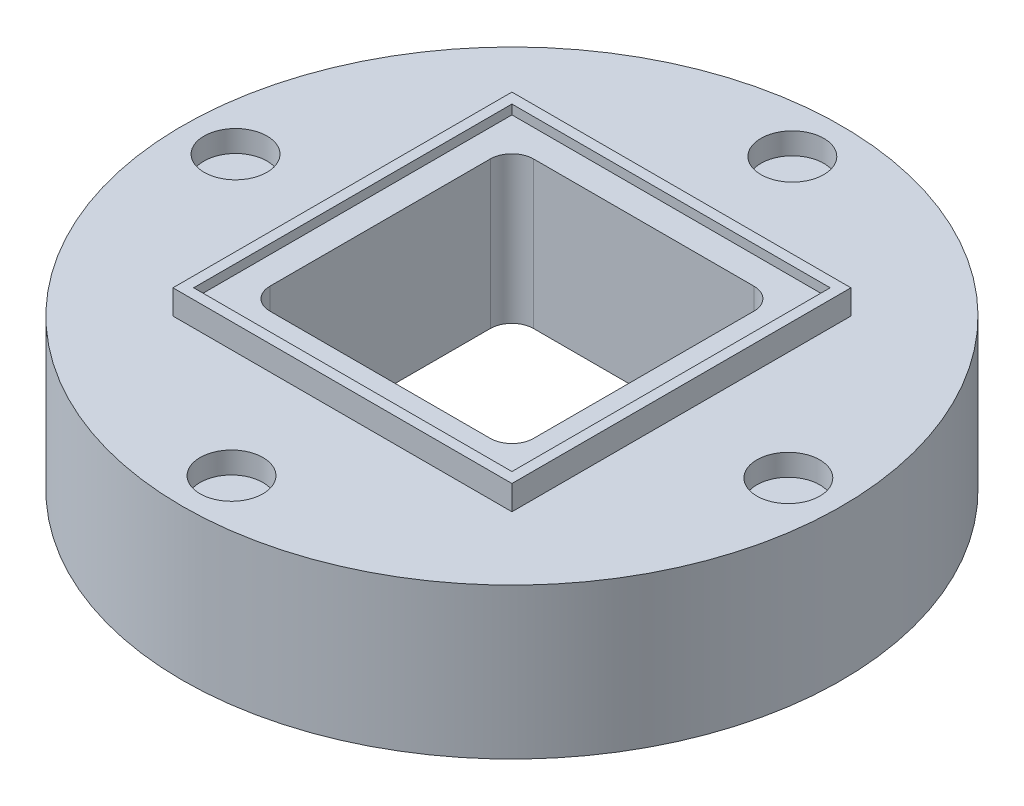
ISO-10303-21;
HEADER;
FILE_DESCRIPTION(('STEP AP214'),'2;1');
FILE_NAME('part.step','',(''),(''),'','','');
FILE_SCHEMA(('AUTOMOTIVE_DESIGN { 1 0 10303 214 1 1 1 1 }'));
ENDSEC;
DATA;
#1=APPLICATION_CONTEXT('core data for automotive mechanical design processes');
#2=APPLICATION_PROTOCOL_DEFINITION('international standard','automotive_design',2000,#1);
#3=PRODUCT_CONTEXT('',#1,'mechanical');
#4=PRODUCT('Part','Part','',(#3));
#5=PRODUCT_RELATED_PRODUCT_CATEGORY('part','',(#4));
#6=PRODUCT_DEFINITION_FORMATION('','',#4);
#7=PRODUCT_DEFINITION_CONTEXT('part definition',#1,'design');
#8=PRODUCT_DEFINITION('design','',#6,#7);
#9=PRODUCT_DEFINITION_SHAPE('','',#8);
#10=(LENGTH_UNIT() NAMED_UNIT(*) SI_UNIT(.MILLI.,.METRE.));
#11=(NAMED_UNIT(*) PLANE_ANGLE_UNIT() SI_UNIT($,.RADIAN.));
#12=(NAMED_UNIT(*) SI_UNIT($,.STERADIAN.) SOLID_ANGLE_UNIT());
#13=UNCERTAINTY_MEASURE_WITH_UNIT(LENGTH_MEASURE(1.E-05),#10,'distance_accuracy_value','');
#14=(GEOMETRIC_REPRESENTATION_CONTEXT(3) GLOBAL_UNCERTAINTY_ASSIGNED_CONTEXT((#13)) GLOBAL_UNIT_ASSIGNED_CONTEXT((#10,
#11,#12)) REPRESENTATION_CONTEXT('',''));
#15=CARTESIAN_POINT('',(0.,0.,0.));
#16=DIRECTION('',(0.,0.,1.));
#17=DIRECTION('',(1.,0.,0.));
#18=AXIS2_PLACEMENT_3D('',#15,#16,#17);
#19=CARTESIAN_POINT('',(0.,1.,0.));
#20=DIRECTION('',(0.,-1.,0.));
#21=DIRECTION('',(0.,0.,-1.));
#22=AXIS2_PLACEMENT_3D('',#19,#20,#21);
#23=PLANE('',#22);
#24=CARTESIAN_POINT('',(0.,1.,0.));
#25=DIRECTION('',(0.,-1.,0.));
#26=DIRECTION('',(0.,0.,-1.));
#27=AXIS2_PLACEMENT_3D('',#24,#25,#26);
#28=CIRCLE('',#27,16.5);
#29=CARTESIAN_POINT('',(0.,1.,-16.5));
#30=VERTEX_POINT('',#29);
#31=EDGE_CURVE('E301',#30,#30,#28,.T.);
#32=ORIENTED_EDGE('',*,*,#31,.T.);
#33=EDGE_LOOP('',(#32));
#34=FACE_BOUND('',#33,.T.);
#35=DIRECTION('',(-1.,0.,0.));
#36=VECTOR('',#35,1.);
#37=CARTESIAN_POINT('',(0.,1.,-7.));
#38=LINE('',#37,#36);
#39=CARTESIAN_POINT('',(5.85,1.,-7.));
#40=VERTEX_POINT('',#39);
#41=CARTESIAN_POINT('',(-5.85,1.,-7.));
#42=VERTEX_POINT('',#41);
#43=EDGE_CURVE('E211',#40,#42,#38,.T.);
#44=ORIENTED_EDGE('',*,*,#43,.T.);
#45=CARTESIAN_POINT('',(-5.85,1.,-5.84999999999964));
#46=DIRECTION('',(0.,-1.,0.));
#47=DIRECTION('',(0.,0.,-1.));
#48=AXIS2_PLACEMENT_3D('',#45,#46,#47);
#49=CIRCLE('',#48,1.15);
#50=CARTESIAN_POINT('',(-7.,1.,-5.84999999999964));
#51=VERTEX_POINT('',#50);
#52=EDGE_CURVE('E214',#42,#51,#49,.F.);
#53=ORIENTED_EDGE('',*,*,#52,.T.);
#54=DIRECTION('',(0.,0.,1.));
#55=VECTOR('',#54,1.);
#56=CARTESIAN_POINT('',(-7.,1.,0.));
#57=LINE('',#56,#55);
#58=CARTESIAN_POINT('',(-7.,1.,5.85000000000035));
#59=VERTEX_POINT('',#58);
#60=EDGE_CURVE('E188',#51,#59,#57,.T.);
#61=ORIENTED_EDGE('',*,*,#60,.T.);
#62=CARTESIAN_POINT('',(-5.84999999999964,1.,5.85000000000035));
#63=DIRECTION('',(0.,-1.,0.));
#64=DIRECTION('',(0.,0.,-1.));
#65=AXIS2_PLACEMENT_3D('',#62,#63,#64);
#66=CIRCLE('',#65,1.15);
#67=CARTESIAN_POINT('',(-5.84999999999964,1.,7.));
#68=VERTEX_POINT('',#67);
#69=EDGE_CURVE('E157',#59,#68,#66,.F.);
#70=ORIENTED_EDGE('',*,*,#69,.T.);
#71=DIRECTION('',(-1.,0.,0.));
#72=VECTOR('',#71,1.);
#73=CARTESIAN_POINT('',(0.,1.,7.));
#74=LINE('',#73,#72);
#75=CARTESIAN_POINT('',(5.85000000000035,1.,7.));
#76=VERTEX_POINT('',#75);
#77=EDGE_CURVE('E201',#76,#68,#74,.T.);
#78=ORIENTED_EDGE('',*,*,#77,.F.);
#79=CARTESIAN_POINT('',(5.85000000000035,1.,5.85));
#80=DIRECTION('',(0.,-1.,0.));
#81=DIRECTION('',(0.,0.,-1.));
#82=AXIS2_PLACEMENT_3D('',#79,#80,#81);
#83=CIRCLE('',#82,1.15);
#84=CARTESIAN_POINT('',(7.,1.,5.85));
#85=VERTEX_POINT('',#84);
#86=EDGE_CURVE('E203',#76,#85,#83,.F.);
#87=ORIENTED_EDGE('',*,*,#86,.T.);
#88=DIRECTION('',(0.,0.,1.));
#89=VECTOR('',#88,1.);
#90=CARTESIAN_POINT('',(7.,1.,0.));
#91=LINE('',#90,#89);
#92=CARTESIAN_POINT('',(7.,1.,-5.85));
#93=VERTEX_POINT('',#92);
#94=EDGE_CURVE('E206',#93,#85,#91,.T.);
#95=ORIENTED_EDGE('',*,*,#94,.F.);
#96=CARTESIAN_POINT('',(5.85,1.,-5.85));
#97=DIRECTION('',(0.,-1.,0.));
#98=DIRECTION('',(0.,0.,-1.));
#99=AXIS2_PLACEMENT_3D('',#96,#97,#98);
#100=CIRCLE('',#99,1.15);
#101=EDGE_CURVE('E208',#93,#40,#100,.F.);
#102=ORIENTED_EDGE('',*,*,#101,.T.);
#103=EDGE_LOOP('',(#44,#53,#61,#70,#78,#87,#95,#102));
#104=FACE_BOUND('',#103,.T.);
#105=ADVANCED_FACE('F38',(#34,#104),#23,.T.);
#106=CARTESIAN_POINT('',(0.,8.8,0.));
#107=DIRECTION('',(0.,1.,0.));
#108=DIRECTION('',(0.,0.,1.));
#109=AXIS2_PLACEMENT_3D('',#106,#107,#108);
#110=PLANE('',#109);
#111=DIRECTION('',(-1.,0.,0.));
#112=VECTOR('',#111,1.);
#113=CARTESIAN_POINT('',(0.,8.8,8.45));
#114=LINE('',#113,#112);
#115=CARTESIAN_POINT('',(8.45,8.8,8.45));
#116=VERTEX_POINT('',#115);
#117=CARTESIAN_POINT('',(-8.45,8.8,8.45));
#118=VERTEX_POINT('',#117);
#119=EDGE_CURVE('E222',#116,#118,#114,.T.);
#120=ORIENTED_EDGE('',*,*,#119,.F.);
#121=DIRECTION('',(0.,0.,-1.));
#122=VECTOR('',#121,1.);
#123=CARTESIAN_POINT('',(8.45,8.8,0.));
#124=LINE('',#123,#122);
#125=CARTESIAN_POINT('',(8.45,8.8,-8.45));
#126=VERTEX_POINT('',#125);
#127=EDGE_CURVE('E11',#116,#126,#124,.T.);
#128=ORIENTED_EDGE('',*,*,#127,.T.);
#129=DIRECTION('',(-1.,0.,0.));
#130=VECTOR('',#129,1.);
#131=CARTESIAN_POINT('',(0.,8.8,-8.45));
#132=LINE('',#131,#130);
#133=CARTESIAN_POINT('',(-8.45,8.8,-8.45));
#134=VERTEX_POINT('',#133);
#135=EDGE_CURVE('E217',#126,#134,#132,.T.);
#136=ORIENTED_EDGE('',*,*,#135,.T.);
#137=DIRECTION('',(0.,0.,-1.));
#138=VECTOR('',#137,1.);
#139=CARTESIAN_POINT('',(-8.45,8.8,0.));
#140=LINE('',#139,#138);
#141=EDGE_CURVE('E220',#118,#134,#140,.T.);
#142=ORIENTED_EDGE('',*,*,#141,.F.);
#143=EDGE_LOOP('',(#120,#128,#136,#142));
#144=FACE_BOUND('',#143,.T.);
#145=DIRECTION('',(0.,0.,-1.));
#146=VECTOR('',#145,1.);
#147=CARTESIAN_POINT('',(-7.,8.8,0.));
#148=LINE('',#147,#146);
#149=CARTESIAN_POINT('',(-7.,8.8,5.85000000000035));
#150=VERTEX_POINT('',#149);
#151=CARTESIAN_POINT('',(-7.,8.8,-5.84999999999964));
#152=VERTEX_POINT('',#151);
#153=EDGE_CURVE('E163',#150,#152,#148,.T.);
#154=ORIENTED_EDGE('',*,*,#153,.T.);
#155=CARTESIAN_POINT('',(-5.85,8.8,-5.84999999999964));
#156=DIRECTION('',(0.,1.,0.));
#157=DIRECTION('',(0.,0.,1.));
#158=AXIS2_PLACEMENT_3D('',#155,#156,#157);
#159=CIRCLE('',#158,1.15);
#160=CARTESIAN_POINT('',(-5.85,8.8,-7.));
#161=VERTEX_POINT('',#160);
#162=EDGE_CURVE('E61',#152,#161,#159,.F.);
#163=ORIENTED_EDGE('',*,*,#162,.T.);
#164=DIRECTION('',(1.,0.,0.));
#165=VECTOR('',#164,1.);
#166=CARTESIAN_POINT('',(0.,8.8,-7.));
#167=LINE('',#166,#165);
#168=CARTESIAN_POINT('',(5.85,8.8,-7.));
#169=VERTEX_POINT('',#168);
#170=EDGE_CURVE('E183',#161,#169,#167,.T.);
#171=ORIENTED_EDGE('',*,*,#170,.T.);
#172=CARTESIAN_POINT('',(5.85,8.8,-5.85));
#173=DIRECTION('',(0.,1.,0.));
#174=DIRECTION('',(0.,0.,1.));
#175=AXIS2_PLACEMENT_3D('',#172,#173,#174);
#176=CIRCLE('',#175,1.15);
#177=CARTESIAN_POINT('',(7.,8.8,-5.85));
#178=VERTEX_POINT('',#177);
#179=EDGE_CURVE('E180',#169,#178,#176,.F.);
#180=ORIENTED_EDGE('',*,*,#179,.T.);
#181=DIRECTION('',(0.,0.,-1.));
#182=VECTOR('',#181,1.);
#183=CARTESIAN_POINT('',(7.,8.8,0.));
#184=LINE('',#183,#182);
#185=CARTESIAN_POINT('',(7.,8.8,5.85));
#186=VERTEX_POINT('',#185);
#187=EDGE_CURVE('E177',#186,#178,#184,.T.);
#188=ORIENTED_EDGE('',*,*,#187,.F.);
#189=CARTESIAN_POINT('',(5.85000000000035,8.8,5.85));
#190=DIRECTION('',(0.,1.,0.));
#191=DIRECTION('',(0.,0.,1.));
#192=AXIS2_PLACEMENT_3D('',#189,#190,#191);
#193=CIRCLE('',#192,1.15);
#194=CARTESIAN_POINT('',(5.85000000000035,8.8,7.));
#195=VERTEX_POINT('',#194);
#196=EDGE_CURVE('E172',#186,#195,#193,.F.);
#197=ORIENTED_EDGE('',*,*,#196,.T.);
#198=DIRECTION('',(1.,0.,0.));
#199=VECTOR('',#198,1.);
#200=CARTESIAN_POINT('',(0.,8.8,7.));
#201=LINE('',#200,#199);
#202=CARTESIAN_POINT('',(-5.84999999999964,8.8,7.));
#203=VERTEX_POINT('',#202);
#204=EDGE_CURVE('E170',#203,#195,#201,.T.);
#205=ORIENTED_EDGE('',*,*,#204,.F.);
#206=CARTESIAN_POINT('',(-5.84999999999964,8.8,5.85000000000035));
#207=DIRECTION('',(0.,1.,0.));
#208=DIRECTION('',(0.,0.,1.));
#209=AXIS2_PLACEMENT_3D('',#206,#207,#208);
#210=CIRCLE('',#209,1.15);
#211=EDGE_CURVE('E154',#203,#150,#210,.F.);
#212=ORIENTED_EDGE('',*,*,#211,.T.);
#213=EDGE_LOOP('',(#154,#163,#171,#180,#188,#197,#205,#212));
#214=FACE_BOUND('',#213,.T.);
#215=ADVANCED_FACE('F167',(#144,#214),#110,.T.);
#216=CARTESIAN_POINT('',(0.,8.,0.));
#217=DIRECTION('',(0.,-1.,0.));
#218=DIRECTION('',(0.,0.,-1.));
#219=AXIS2_PLACEMENT_3D('',#216,#217,#218);
#220=CYLINDRICAL_SURFACE('',#219,17.5);
#221=CARTESIAN_POINT('',(0.,8.,0.));
#222=DIRECTION('',(0.,1.,0.));
#223=DIRECTION('',(0.,0.,1.));
#224=AXIS2_PLACEMENT_3D('',#221,#222,#223);
#225=CIRCLE('',#224,17.5);
#226=CARTESIAN_POINT('',(0.,8.,17.5));
#227=VERTEX_POINT('',#226);
#228=EDGE_CURVE('E46',#227,#227,#225,.T.);
#229=ORIENTED_EDGE('',*,*,#228,.F.);
#230=EDGE_LOOP('',(#229));
#231=FACE_BOUND('',#230,.T.);
#232=CARTESIAN_POINT('',(0.,0.,0.));
#233=DIRECTION('',(0.,1.,0.));
#234=DIRECTION('',(0.,0.,1.));
#235=AXIS2_PLACEMENT_3D('',#232,#233,#234);
#236=CIRCLE('',#235,17.5);
#237=CARTESIAN_POINT('',(0.,0.,17.5));
#238=VERTEX_POINT('',#237);
#239=EDGE_CURVE('E304',#238,#238,#236,.T.);
#240=ORIENTED_EDGE('',*,*,#239,.T.);
#241=EDGE_LOOP('',(#240));
#242=FACE_BOUND('',#241,.T.);
#243=ADVANCED_FACE('F40',(#231,#242),#220,.T.);
#244=CARTESIAN_POINT('',(0.,8.,0.));
#245=DIRECTION('',(0.,1.,0.));
#246=DIRECTION('',(0.,0.,1.));
#247=AXIS2_PLACEMENT_3D('',#244,#245,#246);
#248=PLANE('',#247);
#249=DIRECTION('',(0.,0.,-1.));
#250=VECTOR('',#249,1.);
#251=CARTESIAN_POINT('',(-9.,8.,0.));
#252=LINE('',#251,#250);
#253=CARTESIAN_POINT('',(-9.,8.,9.));
#254=VERTEX_POINT('',#253);
#255=CARTESIAN_POINT('',(-9.,8.,-9.));
#256=VERTEX_POINT('',#255);
#257=EDGE_CURVE('E224',#254,#256,#252,.T.);
#258=ORIENTED_EDGE('',*,*,#257,.T.);
#259=DIRECTION('',(-1.,0.,0.));
#260=VECTOR('',#259,1.);
#261=CARTESIAN_POINT('',(0.,8.,-9.));
#262=LINE('',#261,#260);
#263=CARTESIAN_POINT('',(9.,8.,-9.));
#264=VERTEX_POINT('',#263);
#265=EDGE_CURVE('E229',#264,#256,#262,.T.);
#266=ORIENTED_EDGE('',*,*,#265,.F.);
#267=DIRECTION('',(0.,0.,-1.));
#268=VECTOR('',#267,1.);
#269=CARTESIAN_POINT('',(9.,8.,0.));
#270=LINE('',#269,#268);
#271=CARTESIAN_POINT('',(9.,8.,9.));
#272=VERTEX_POINT('',#271);
#273=EDGE_CURVE('E253',#272,#264,#270,.T.);
#274=ORIENTED_EDGE('',*,*,#273,.F.);
#275=DIRECTION('',(-1.,0.,0.));
#276=VECTOR('',#275,1.);
#277=CARTESIAN_POINT('',(0.,8.,9.));
#278=LINE('',#277,#276);
#279=EDGE_CURVE('E250',#272,#254,#278,.T.);
#280=ORIENTED_EDGE('',*,*,#279,.T.);
#281=EDGE_LOOP('',(#258,#266,#274,#280));
#282=FACE_BOUND('',#281,.T.);
#283=CARTESIAN_POINT('',(14.7834126807695,8.,0.106708515967393));
#284=DIRECTION('',(0.,1.,0.));
#285=DIRECTION('',(-1.,0.,0.));
#286=AXIS2_PLACEMENT_3D('',#283,#284,#285);
#287=CIRCLE('',#286,1.67);
#288=CARTESIAN_POINT('',(13.1134126807695,8.,0.106708515967411));
#289=VERTEX_POINT('',#288);
#290=EDGE_CURVE('E270',#289,#289,#287,.T.);
#291=ORIENTED_EDGE('',*,*,#290,.F.);
#292=EDGE_LOOP('',(#291));
#293=FACE_BOUND('',#292,.T.);
#294=CARTESIAN_POINT('',(-0.106708515967548,8.,14.7834126807695));
#295=DIRECTION('',(0.,1.,0.));
#296=DIRECTION('',(0.,0.,-1.));
#297=AXIS2_PLACEMENT_3D('',#294,#295,#296);
#298=CIRCLE('',#297,1.67);
#299=CARTESIAN_POINT('',(-0.106708515967548,8.,13.1134126807695));
#300=VERTEX_POINT('',#299);
#301=EDGE_CURVE('E280',#300,#300,#298,.T.);
#302=ORIENTED_EDGE('',*,*,#301,.F.);
#303=EDGE_LOOP('',(#302));
#304=FACE_BOUND('',#303,.T.);
#305=CARTESIAN_POINT('',(-14.7834126807695,8.,-0.106708515967496));
#306=DIRECTION('',(0.,1.,0.));
#307=DIRECTION('',(1.,0.,0.));
#308=AXIS2_PLACEMENT_3D('',#305,#306,#307);
#309=CIRCLE('',#308,1.67);
#310=CARTESIAN_POINT('',(-13.1134126807695,8.,-0.106708515967502));
#311=VERTEX_POINT('',#310);
#312=EDGE_CURVE('E286',#311,#311,#309,.T.);
#313=ORIENTED_EDGE('',*,*,#312,.F.);
#314=EDGE_LOOP('',(#313));
#315=FACE_BOUND('',#314,.T.);
#316=CARTESIAN_POINT('',(0.106708515967548,8.,-14.7834126807695));
#317=DIRECTION('',(0.,1.,0.));
#318=DIRECTION('',(0.,0.,1.));
#319=AXIS2_PLACEMENT_3D('',#316,#317,#318);
#320=CIRCLE('',#319,1.67);
#321=CARTESIAN_POINT('',(0.106708515967548,8.,-13.1134126807695));
#322=VERTEX_POINT('',#321);
#323=EDGE_CURVE('E292',#322,#322,#320,.T.);
#324=ORIENTED_EDGE('',*,*,#323,.F.);
#325=EDGE_LOOP('',(#324));
#326=FACE_BOUND('',#325,.T.);
#327=ORIENTED_EDGE('',*,*,#228,.T.);
#328=EDGE_LOOP('',(#327));
#329=FACE_BOUND('',#328,.T.);
#330=ADVANCED_FACE('F315',(#282,#293,#304,#315,#326,#329),#248,.T.);
#331=CARTESIAN_POINT('',(0.,0.,0.));
#332=DIRECTION('',(0.,1.,0.));
#333=DIRECTION('',(0.,0.,1.));
#334=AXIS2_PLACEMENT_3D('',#331,#332,#333);
#335=PLANE('',#334);
#336=CARTESIAN_POINT('',(0.,0.,0.));
#337=DIRECTION('',(0.,-1.,0.));
#338=DIRECTION('',(0.,0.,-1.));
#339=AXIS2_PLACEMENT_3D('',#336,#337,#338);
#340=CIRCLE('',#339,16.5);
#341=CARTESIAN_POINT('',(0.,0.,-16.5));
#342=VERTEX_POINT('',#341);
#343=EDGE_CURVE('E298',#342,#342,#340,.T.);
#344=ORIENTED_EDGE('',*,*,#343,.F.);
#345=EDGE_LOOP('',(#344));
#346=FACE_BOUND('',#345,.T.);
#347=ORIENTED_EDGE('',*,*,#239,.F.);
#348=EDGE_LOOP('',(#347));
#349=FACE_BOUND('',#348,.T.);
#350=ADVANCED_FACE('F312',(#346,#349),#335,.F.);
#351=CARTESIAN_POINT('',(0.,1.,0.));
#352=DIRECTION('',(0.,-1.,0.));
#353=DIRECTION('',(0.,0.,-1.));
#354=AXIS2_PLACEMENT_3D('',#351,#352,#353);
#355=CYLINDRICAL_SURFACE('',#354,16.5);
#356=ORIENTED_EDGE('',*,*,#31,.F.);
#357=EDGE_LOOP('',(#356));
#358=FACE_BOUND('',#357,.T.);
#359=ORIENTED_EDGE('',*,*,#343,.T.);
#360=EDGE_LOOP('',(#359));
#361=FACE_BOUND('',#360,.T.);
#362=ADVANCED_FACE('F314',(#358,#361),#355,.F.);
#363=CARTESIAN_POINT('',(0.106708515967548,6.85,-14.7834126807695));
#364=DIRECTION('',(0.,1.,0.));
#365=DIRECTION('',(0.,0.,1.));
#366=AXIS2_PLACEMENT_3D('',#363,#364,#365);
#367=CYLINDRICAL_SURFACE('',#366,1.67);
#368=CARTESIAN_POINT('',(0.106708515967548,6.85,-14.7834126807695));
#369=DIRECTION('',(0.,1.,0.));
#370=DIRECTION('',(0.,0.,1.));
#371=AXIS2_PLACEMENT_3D('',#368,#369,#370);
#372=CIRCLE('',#371,1.67);
#373=CARTESIAN_POINT('',(0.106708515967548,6.85,-13.1134126807695));
#374=VERTEX_POINT('',#373);
#375=EDGE_CURVE('E295',#374,#374,#372,.T.);
#376=ORIENTED_EDGE('',*,*,#375,.F.);
#377=EDGE_LOOP('',(#376));
#378=FACE_BOUND('',#377,.T.);
#379=ORIENTED_EDGE('',*,*,#323,.T.);
#380=EDGE_LOOP('',(#379));
#381=FACE_BOUND('',#380,.T.);
#382=ADVANCED_FACE('F321',(#378,#381),#367,.F.);
#383=CARTESIAN_POINT('',(0.106708515967548,6.85,-14.7834126807695));
#384=DIRECTION('',(0.,1.,0.));
#385=DIRECTION('',(0.,0.,1.));
#386=AXIS2_PLACEMENT_3D('',#383,#384,#385);
#387=PLANE('',#386);
#388=ORIENTED_EDGE('',*,*,#375,.T.);
#389=EDGE_LOOP('',(#388));
#390=FACE_BOUND('',#389,.T.);
#391=ADVANCED_FACE('F339',(#390),#387,.T.);
#392=CARTESIAN_POINT('',(-14.7834126807695,6.85,-0.106708515967496));
#393=DIRECTION('',(0.,1.,0.));
#394=DIRECTION('',(0.,0.,1.));
#395=AXIS2_PLACEMENT_3D('',#392,#393,#394);
#396=CYLINDRICAL_SURFACE('',#395,1.67);
#397=CARTESIAN_POINT('',(-14.7834126807695,6.85,-0.106708515967496));
#398=DIRECTION('',(0.,1.,0.));
#399=DIRECTION('',(1.,0.,0.));
#400=AXIS2_PLACEMENT_3D('',#397,#398,#399);
#401=CIRCLE('',#400,1.67);
#402=CARTESIAN_POINT('',(-13.1134126807695,6.85,-0.106708515967502));
#403=VERTEX_POINT('',#402);
#404=EDGE_CURVE('E289',#403,#403,#401,.T.);
#405=ORIENTED_EDGE('',*,*,#404,.F.);
#406=EDGE_LOOP('',(#405));
#407=FACE_BOUND('',#406,.T.);
#408=ORIENTED_EDGE('',*,*,#312,.T.);
#409=EDGE_LOOP('',(#408));
#410=FACE_BOUND('',#409,.T.);
#411=ADVANCED_FACE('F343',(#407,#410),#396,.F.);
#412=CARTESIAN_POINT('',(-14.7834126807695,6.85,-0.106708515967496));
#413=DIRECTION('',(0.,1.,0.));
#414=DIRECTION('',(1.,0.,0.));
#415=AXIS2_PLACEMENT_3D('',#412,#413,#414);
#416=PLANE('',#415);
#417=ORIENTED_EDGE('',*,*,#404,.T.);
#418=EDGE_LOOP('',(#417));
#419=FACE_BOUND('',#418,.T.);
#420=ADVANCED_FACE('F347',(#419),#416,.T.);
#421=CARTESIAN_POINT('',(-0.106708515967548,6.85,14.7834126807695));
#422=DIRECTION('',(0.,1.,0.));
#423=DIRECTION('',(0.,0.,1.));
#424=AXIS2_PLACEMENT_3D('',#421,#422,#423);
#425=CYLINDRICAL_SURFACE('',#424,1.67);
#426=CARTESIAN_POINT('',(-0.106708515967548,6.85,14.7834126807695));
#427=DIRECTION('',(0.,1.,0.));
#428=DIRECTION('',(0.,0.,-1.));
#429=AXIS2_PLACEMENT_3D('',#426,#427,#428);
#430=CIRCLE('',#429,1.67);
#431=CARTESIAN_POINT('',(-0.106708515967548,6.85,13.1134126807695));
#432=VERTEX_POINT('',#431);
#433=EDGE_CURVE('E283',#432,#432,#430,.T.);
#434=ORIENTED_EDGE('',*,*,#433,.F.);
#435=EDGE_LOOP('',(#434));
#436=FACE_BOUND('',#435,.T.);
#437=ORIENTED_EDGE('',*,*,#301,.T.);
#438=EDGE_LOOP('',(#437));
#439=FACE_BOUND('',#438,.T.);
#440=ADVANCED_FACE('F351',(#436,#439),#425,.F.);
#441=CARTESIAN_POINT('',(-0.106708515967548,6.85,14.7834126807695));
#442=DIRECTION('',(0.,1.,0.));
#443=DIRECTION('',(0.,0.,-1.));
#444=AXIS2_PLACEMENT_3D('',#441,#442,#443);
#445=PLANE('',#444);
#446=ORIENTED_EDGE('',*,*,#433,.T.);
#447=EDGE_LOOP('',(#446));
#448=FACE_BOUND('',#447,.T.);
#449=ADVANCED_FACE('F355',(#448),#445,.T.);
#450=CARTESIAN_POINT('',(14.7834126807695,6.85,0.106708515967393));
#451=DIRECTION('',(0.,1.,0.));
#452=DIRECTION('',(0.,0.,1.));
#453=AXIS2_PLACEMENT_3D('',#450,#451,#452);
#454=CYLINDRICAL_SURFACE('',#453,1.67);
#455=CARTESIAN_POINT('',(14.7834126807695,6.85,0.106708515967393));
#456=DIRECTION('',(0.,1.,0.));
#457=DIRECTION('',(-1.,0.,0.));
#458=AXIS2_PLACEMENT_3D('',#455,#456,#457);
#459=CIRCLE('',#458,1.67);
#460=CARTESIAN_POINT('',(13.1134126807695,6.85,0.106708515967411));
#461=VERTEX_POINT('',#460);
#462=EDGE_CURVE('E277',#461,#461,#459,.T.);
#463=ORIENTED_EDGE('',*,*,#462,.F.);
#464=EDGE_LOOP('',(#463));
#465=FACE_BOUND('',#464,.T.);
#466=ORIENTED_EDGE('',*,*,#290,.T.);
#467=EDGE_LOOP('',(#466));
#468=FACE_BOUND('',#467,.T.);
#469=ADVANCED_FACE('F359',(#465,#468),#454,.F.);
#470=CARTESIAN_POINT('',(14.7834126807695,6.85,0.106708515967393));
#471=DIRECTION('',(0.,1.,0.));
#472=DIRECTION('',(-1.,0.,0.));
#473=AXIS2_PLACEMENT_3D('',#470,#471,#472);
#474=PLANE('',#473);
#475=ORIENTED_EDGE('',*,*,#462,.T.);
#476=EDGE_LOOP('',(#475));
#477=FACE_BOUND('',#476,.T.);
#478=ADVANCED_FACE('F363',(#477),#474,.T.);
#479=CARTESIAN_POINT('',(0.,9.3,8.45));
#480=DIRECTION('',(0.,0.,1.));
#481=DIRECTION('',(1.,0.,0.));
#482=AXIS2_PLACEMENT_3D('',#479,#480,#481);
#483=PLANE('',#482);
#484=DIRECTION('',(0.,-1.,0.));
#485=VECTOR('',#484,1.);
#486=CARTESIAN_POINT('',(8.45,9.3,8.45));
#487=LINE('',#486,#485);
#488=CARTESIAN_POINT('',(8.45,9.3,8.45));
#489=VERTEX_POINT('',#488);
#490=EDGE_CURVE('E258',#489,#116,#487,.T.);
#491=ORIENTED_EDGE('',*,*,#490,.T.);
#492=ORIENTED_EDGE('',*,*,#119,.T.);
#493=DIRECTION('',(0.,-1.,0.));
#494=VECTOR('',#493,1.);
#495=CARTESIAN_POINT('',(-8.45,9.3,8.45));
#496=LINE('',#495,#494);
#497=CARTESIAN_POINT('',(-8.45,9.3,8.45));
#498=VERTEX_POINT('',#497);
#499=EDGE_CURVE('E267',#498,#118,#496,.T.);
#500=ORIENTED_EDGE('',*,*,#499,.F.);
#501=DIRECTION('',(-1.,0.,0.));
#502=VECTOR('',#501,1.);
#503=CARTESIAN_POINT('',(0.,9.3,8.45));
#504=LINE('',#503,#502);
#505=EDGE_CURVE('E236',#489,#498,#504,.T.);
#506=ORIENTED_EDGE('',*,*,#505,.F.);
#507=EDGE_LOOP('',(#491,#492,#500,#506));
#508=FACE_BOUND('',#507,.T.);
#509=ADVANCED_FACE('F367',(#508),#483,.F.);
#510=CARTESIAN_POINT('',(-8.45,9.3,0.));
#511=DIRECTION('',(-1.,0.,0.));
#512=DIRECTION('',(0.,0.,1.));
#513=AXIS2_PLACEMENT_3D('',#510,#511,#512);
#514=PLANE('',#513);
#515=ORIENTED_EDGE('',*,*,#499,.T.);
#516=ORIENTED_EDGE('',*,*,#141,.T.);
#517=DIRECTION('',(0.,-1.,0.));
#518=VECTOR('',#517,1.);
#519=CARTESIAN_POINT('',(-8.45,9.3,-8.45));
#520=LINE('',#519,#518);
#521=CARTESIAN_POINT('',(-8.45,9.3,-8.45));
#522=VERTEX_POINT('',#521);
#523=EDGE_CURVE('E264',#522,#134,#520,.T.);
#524=ORIENTED_EDGE('',*,*,#523,.F.);
#525=DIRECTION('',(0.,0.,-1.));
#526=VECTOR('',#525,1.);
#527=CARTESIAN_POINT('',(-8.45,9.3,0.));
#528=LINE('',#527,#526);
#529=EDGE_CURVE('E239',#498,#522,#528,.T.);
#530=ORIENTED_EDGE('',*,*,#529,.F.);
#531=EDGE_LOOP('',(#515,#516,#524,#530));
#532=FACE_BOUND('',#531,.T.);
#533=ADVANCED_FACE('F389',(#532),#514,.F.);
#534=CARTESIAN_POINT('',(0.,9.3,-8.45));
#535=DIRECTION('',(0.,0.,1.));
#536=DIRECTION('',(1.,0.,0.));
#537=AXIS2_PLACEMENT_3D('',#534,#535,#536);
#538=PLANE('',#537);
#539=ORIENTED_EDGE('',*,*,#135,.F.);
#540=DIRECTION('',(0.,-1.,0.));
#541=VECTOR('',#540,1.);
#542=CARTESIAN_POINT('',(8.45,9.3,-8.45));
#543=LINE('',#542,#541);
#544=CARTESIAN_POINT('',(8.45,9.3,-8.45));
#545=VERTEX_POINT('',#544);
#546=EDGE_CURVE('E261',#545,#126,#543,.T.);
#547=ORIENTED_EDGE('',*,*,#546,.F.);
#548=DIRECTION('',(-1.,0.,0.));
#549=VECTOR('',#548,1.);
#550=CARTESIAN_POINT('',(0.,9.3,-8.45));
#551=LINE('',#550,#549);
#552=EDGE_CURVE('E241',#545,#522,#551,.T.);
#553=ORIENTED_EDGE('',*,*,#552,.T.);
#554=ORIENTED_EDGE('',*,*,#523,.T.);
#555=EDGE_LOOP('',(#539,#547,#553,#554));
#556=FACE_BOUND('',#555,.T.);
#557=ADVANCED_FACE('F373',(#556),#538,.T.);
#558=CARTESIAN_POINT('',(-9.,9.3,0.));
#559=DIRECTION('',(-1.,0.,0.));
#560=DIRECTION('',(0.,0.,1.));
#561=AXIS2_PLACEMENT_3D('',#558,#559,#560);
#562=PLANE('',#561);
#563=DIRECTION('',(0.,-1.,0.));
#564=VECTOR('',#563,1.);
#565=CARTESIAN_POINT('',(-9.,9.3,-9.));
#566=LINE('',#565,#564);
#567=CARTESIAN_POINT('',(-9.,9.3,-9.));
#568=VERTEX_POINT('',#567);
#569=EDGE_CURVE('E247',#568,#256,#566,.T.);
#570=ORIENTED_EDGE('',*,*,#569,.T.);
#571=ORIENTED_EDGE('',*,*,#257,.F.);
#572=DIRECTION('',(0.,-1.,0.));
#573=VECTOR('',#572,1.);
#574=CARTESIAN_POINT('',(-9.,9.3,9.));
#575=LINE('',#574,#573);
#576=CARTESIAN_POINT('',(-9.,9.3,9.));
#577=VERTEX_POINT('',#576);
#578=EDGE_CURVE('E262',#577,#254,#575,.T.);
#579=ORIENTED_EDGE('',*,*,#578,.F.);
#580=DIRECTION('',(0.,0.,-1.));
#581=VECTOR('',#580,1.);
#582=CARTESIAN_POINT('',(-9.,9.3,0.));
#583=LINE('',#582,#581);
#584=EDGE_CURVE('E225',#577,#568,#583,.T.);
#585=ORIENTED_EDGE('',*,*,#584,.T.);
#586=EDGE_LOOP('',(#570,#571,#579,#585));
#587=FACE_BOUND('',#586,.T.);
#588=ADVANCED_FACE('F369',(#587),#562,.T.);
#589=CARTESIAN_POINT('',(0.,9.3,9.));
#590=DIRECTION('',(0.,0.,1.));
#591=DIRECTION('',(1.,0.,0.));
#592=AXIS2_PLACEMENT_3D('',#589,#590,#591);
#593=PLANE('',#592);
#594=ORIENTED_EDGE('',*,*,#578,.T.);
#595=ORIENTED_EDGE('',*,*,#279,.F.);
#596=DIRECTION('',(0.,-1.,0.));
#597=VECTOR('',#596,1.);
#598=CARTESIAN_POINT('',(9.,9.3,9.));
#599=LINE('',#598,#597);
#600=CARTESIAN_POINT('',(9.,9.3,9.));
#601=VERTEX_POINT('',#600);
#602=EDGE_CURVE('E274',#601,#272,#599,.T.);
#603=ORIENTED_EDGE('',*,*,#602,.F.);
#604=DIRECTION('',(-1.,0.,0.));
#605=VECTOR('',#604,1.);
#606=CARTESIAN_POINT('',(0.,9.3,9.));
#607=LINE('',#606,#605);
#608=EDGE_CURVE('E228',#601,#577,#607,.T.);
#609=ORIENTED_EDGE('',*,*,#608,.T.);
#610=EDGE_LOOP('',(#594,#595,#603,#609));
#611=FACE_BOUND('',#610,.T.);
#612=ADVANCED_FACE('F372',(#611),#593,.T.);
#613=CARTESIAN_POINT('',(9.,9.3,0.));
#614=DIRECTION('',(-1.,0.,0.));
#615=DIRECTION('',(0.,0.,1.));
#616=AXIS2_PLACEMENT_3D('',#613,#614,#615);
#617=PLANE('',#616);
#618=ORIENTED_EDGE('',*,*,#602,.T.);
#619=ORIENTED_EDGE('',*,*,#273,.T.);
#620=DIRECTION('',(0.,-1.,0.));
#621=VECTOR('',#620,1.);
#622=CARTESIAN_POINT('',(9.,9.3,-9.));
#623=LINE('',#622,#621);
#624=CARTESIAN_POINT('',(9.,9.3,-9.));
#625=VERTEX_POINT('',#624);
#626=EDGE_CURVE('E272',#625,#264,#623,.T.);
#627=ORIENTED_EDGE('',*,*,#626,.F.);
#628=DIRECTION('',(0.,0.,-1.));
#629=VECTOR('',#628,1.);
#630=CARTESIAN_POINT('',(9.,9.3,0.));
#631=LINE('',#630,#629);
#632=EDGE_CURVE('E232',#601,#625,#631,.T.);
#633=ORIENTED_EDGE('',*,*,#632,.F.);
#634=EDGE_LOOP('',(#618,#619,#627,#633));
#635=FACE_BOUND('',#634,.T.);
#636=ADVANCED_FACE('F377',(#635),#617,.F.);
#637=CARTESIAN_POINT('',(0.,9.3,-9.));
#638=DIRECTION('',(0.,0.,1.));
#639=DIRECTION('',(1.,0.,0.));
#640=AXIS2_PLACEMENT_3D('',#637,#638,#639);
#641=PLANE('',#640);
#642=ORIENTED_EDGE('',*,*,#626,.T.);
#643=ORIENTED_EDGE('',*,*,#265,.T.);
#644=ORIENTED_EDGE('',*,*,#569,.F.);
#645=DIRECTION('',(-1.,0.,0.));
#646=VECTOR('',#645,1.);
#647=CARTESIAN_POINT('',(0.,9.3,-9.));
#648=LINE('',#647,#646);
#649=EDGE_CURVE('E234',#625,#568,#648,.T.);
#650=ORIENTED_EDGE('',*,*,#649,.F.);
#651=EDGE_LOOP('',(#642,#643,#644,#650));
#652=FACE_BOUND('',#651,.T.);
#653=ADVANCED_FACE('F381',(#652),#641,.F.);
#654=CARTESIAN_POINT('',(8.45,9.3,0.));
#655=DIRECTION('',(-1.,0.,0.));
#656=DIRECTION('',(0.,0.,1.));
#657=AXIS2_PLACEMENT_3D('',#654,#655,#656);
#658=PLANE('',#657);
#659=ORIENTED_EDGE('',*,*,#127,.F.);
#660=ORIENTED_EDGE('',*,*,#490,.F.);
#661=DIRECTION('',(0.,0.,-1.));
#662=VECTOR('',#661,1.);
#663=CARTESIAN_POINT('',(8.45,9.3,0.));
#664=LINE('',#663,#662);
#665=EDGE_CURVE('E244',#489,#545,#664,.T.);
#666=ORIENTED_EDGE('',*,*,#665,.T.);
#667=ORIENTED_EDGE('',*,*,#546,.T.);
#668=EDGE_LOOP('',(#659,#660,#666,#667));
#669=FACE_BOUND('',#668,.T.);
#670=ADVANCED_FACE('F385',(#669),#658,.T.);
#671=CARTESIAN_POINT('',(0.,9.3,0.));
#672=DIRECTION('',(0.,1.,0.));
#673=DIRECTION('',(0.,0.,1.));
#674=AXIS2_PLACEMENT_3D('',#671,#672,#673);
#675=PLANE('',#674);
#676=ORIENTED_EDGE('',*,*,#584,.F.);
#677=ORIENTED_EDGE('',*,*,#608,.F.);
#678=ORIENTED_EDGE('',*,*,#632,.T.);
#679=ORIENTED_EDGE('',*,*,#649,.T.);
#680=EDGE_LOOP('',(#676,#677,#678,#679));
#681=FACE_BOUND('',#680,.T.);
#682=ORIENTED_EDGE('',*,*,#505,.T.);
#683=ORIENTED_EDGE('',*,*,#529,.T.);
#684=ORIENTED_EDGE('',*,*,#552,.F.);
#685=ORIENTED_EDGE('',*,*,#665,.F.);
#686=EDGE_LOOP('',(#682,#683,#684,#685));
#687=FACE_BOUND('',#686,.T.);
#688=ADVANCED_FACE('F399',(#681,#687),#675,.T.);
#689=CARTESIAN_POINT('',(-5.85,0.,-5.84999999999964));
#690=DIRECTION('',(0.,1.,0.));
#691=DIRECTION('',(0.,0.,1.));
#692=AXIS2_PLACEMENT_3D('',#689,#690,#691);
#693=CYLINDRICAL_SURFACE('',#692,1.15);
#694=DIRECTION('',(0.,1.,0.));
#695=VECTOR('',#694,1.);
#696=CARTESIAN_POINT('',(-5.85,0.,-7.));
#697=LINE('',#696,#695);
#698=EDGE_CURVE('E186',#42,#161,#697,.T.);
#699=ORIENTED_EDGE('',*,*,#698,.T.);
#700=ORIENTED_EDGE('',*,*,#162,.F.);
#701=DIRECTION('',(0.,1.,0.));
#702=VECTOR('',#701,1.);
#703=CARTESIAN_POINT('',(-7.,0.,-5.84999999999964));
#704=LINE('',#703,#702);
#705=EDGE_CURVE('E160',#51,#152,#704,.T.);
#706=ORIENTED_EDGE('',*,*,#705,.F.);
#707=ORIENTED_EDGE('',*,*,#52,.F.);
#708=EDGE_LOOP('',(#699,#700,#706,#707));
#709=FACE_BOUND('',#708,.T.);
#710=ADVANCED_FACE('F402',(#709),#693,.F.);
#711=CARTESIAN_POINT('',(0.,0.,-7.));
#712=DIRECTION('',(0.,0.,1.));
#713=DIRECTION('',(1.,0.,0.));
#714=AXIS2_PLACEMENT_3D('',#711,#712,#713);
#715=PLANE('',#714);
#716=DIRECTION('',(0.,1.,0.));
#717=VECTOR('',#716,1.);
#718=CARTESIAN_POINT('',(5.85,0.,-7.));
#719=LINE('',#718,#717);
#720=EDGE_CURVE('E189',#40,#169,#719,.T.);
#721=ORIENTED_EDGE('',*,*,#720,.T.);
#722=ORIENTED_EDGE('',*,*,#170,.F.);
#723=ORIENTED_EDGE('',*,*,#698,.F.);
#724=ORIENTED_EDGE('',*,*,#43,.F.);
#725=EDGE_LOOP('',(#721,#722,#723,#724));
#726=FACE_BOUND('',#725,.T.);
#727=ADVANCED_FACE('F407',(#726),#715,.T.);
#728=CARTESIAN_POINT('',(5.85,0.,-5.85));
#729=DIRECTION('',(0.,1.,0.));
#730=DIRECTION('',(0.,0.,1.));
#731=AXIS2_PLACEMENT_3D('',#728,#729,#730);
#732=CYLINDRICAL_SURFACE('',#731,1.15);
#733=DIRECTION('',(0.,1.,0.));
#734=VECTOR('',#733,1.);
#735=CARTESIAN_POINT('',(7.,0.,-5.85));
#736=LINE('',#735,#734);
#737=EDGE_CURVE('E191',#93,#178,#736,.T.);
#738=ORIENTED_EDGE('',*,*,#737,.T.);
#739=ORIENTED_EDGE('',*,*,#179,.F.);
#740=ORIENTED_EDGE('',*,*,#720,.F.);
#741=ORIENTED_EDGE('',*,*,#101,.F.);
#742=EDGE_LOOP('',(#738,#739,#740,#741));
#743=FACE_BOUND('',#742,.T.);
#744=ADVANCED_FACE('F423',(#743),#732,.F.);
#745=CARTESIAN_POINT('',(7.,0.,0.));
#746=DIRECTION('',(1.,0.,0.));
#747=DIRECTION('',(0.,0.,-1.));
#748=AXIS2_PLACEMENT_3D('',#745,#746,#747);
#749=PLANE('',#748);
#750=ORIENTED_EDGE('',*,*,#94,.T.);
#751=DIRECTION('',(0.,1.,0.));
#752=VECTOR('',#751,1.);
#753=CARTESIAN_POINT('',(7.,0.,5.85));
#754=LINE('',#753,#752);
#755=EDGE_CURVE('E193',#85,#186,#754,.T.);
#756=ORIENTED_EDGE('',*,*,#755,.T.);
#757=ORIENTED_EDGE('',*,*,#187,.T.);
#758=ORIENTED_EDGE('',*,*,#737,.F.);
#759=EDGE_LOOP('',(#750,#756,#757,#758));
#760=FACE_BOUND('',#759,.T.);
#761=ADVANCED_FACE('F419',(#760),#749,.F.);
#762=CARTESIAN_POINT('',(5.85000000000035,0.,5.85));
#763=DIRECTION('',(0.,1.,0.));
#764=DIRECTION('',(0.,0.,1.));
#765=AXIS2_PLACEMENT_3D('',#762,#763,#764);
#766=CYLINDRICAL_SURFACE('',#765,1.15);
#767=DIRECTION('',(0.,1.,0.));
#768=VECTOR('',#767,1.);
#769=CARTESIAN_POINT('',(5.85000000000035,0.,7.));
#770=LINE('',#769,#768);
#771=EDGE_CURVE('E195',#76,#195,#770,.T.);
#772=ORIENTED_EDGE('',*,*,#771,.T.);
#773=ORIENTED_EDGE('',*,*,#196,.F.);
#774=ORIENTED_EDGE('',*,*,#755,.F.);
#775=ORIENTED_EDGE('',*,*,#86,.F.);
#776=EDGE_LOOP('',(#772,#773,#774,#775));
#777=FACE_BOUND('',#776,.T.);
#778=ADVANCED_FACE('F415',(#777),#766,.F.);
#779=CARTESIAN_POINT('',(0.,0.,7.));
#780=DIRECTION('',(0.,0.,1.));
#781=DIRECTION('',(1.,0.,0.));
#782=AXIS2_PLACEMENT_3D('',#779,#780,#781);
#783=PLANE('',#782);
#784=ORIENTED_EDGE('',*,*,#77,.T.);
#785=DIRECTION('',(0.,1.,0.));
#786=VECTOR('',#785,1.);
#787=CARTESIAN_POINT('',(-5.84999999999964,0.,7.));
#788=LINE('',#787,#786);
#789=EDGE_CURVE('E159',#68,#203,#788,.T.);
#790=ORIENTED_EDGE('',*,*,#789,.T.);
#791=ORIENTED_EDGE('',*,*,#204,.T.);
#792=ORIENTED_EDGE('',*,*,#771,.F.);
#793=EDGE_LOOP('',(#784,#790,#791,#792));
#794=FACE_BOUND('',#793,.T.);
#795=ADVANCED_FACE('F412',(#794),#783,.F.);
#796=CARTESIAN_POINT('',(-5.84999999999964,0.,5.85000000000035));
#797=DIRECTION('',(0.,1.,0.));
#798=DIRECTION('',(0.,0.,1.));
#799=AXIS2_PLACEMENT_3D('',#796,#797,#798);
#800=CYLINDRICAL_SURFACE('',#799,1.15);
#801=DIRECTION('',(0.,1.,0.));
#802=VECTOR('',#801,1.);
#803=CARTESIAN_POINT('',(-7.,0.,5.85000000000035));
#804=LINE('',#803,#802);
#805=EDGE_CURVE('E53',#59,#150,#804,.T.);
#806=ORIENTED_EDGE('',*,*,#805,.T.);
#807=ORIENTED_EDGE('',*,*,#211,.F.);
#808=ORIENTED_EDGE('',*,*,#789,.F.);
#809=ORIENTED_EDGE('',*,*,#69,.F.);
#810=EDGE_LOOP('',(#806,#807,#808,#809));
#811=FACE_BOUND('',#810,.T.);
#812=ADVANCED_FACE('F151',(#811),#800,.F.);
#813=CARTESIAN_POINT('',(-7.,0.,0.));
#814=DIRECTION('',(1.,0.,0.));
#815=DIRECTION('',(0.,0.,-1.));
#816=AXIS2_PLACEMENT_3D('',#813,#814,#815);
#817=PLANE('',#816);
#818=ORIENTED_EDGE('',*,*,#705,.T.);
#819=ORIENTED_EDGE('',*,*,#153,.F.);
#820=ORIENTED_EDGE('',*,*,#805,.F.);
#821=ORIENTED_EDGE('',*,*,#60,.F.);
#822=EDGE_LOOP('',(#818,#819,#820,#821));
#823=FACE_BOUND('',#822,.T.);
#824=ADVANCED_FACE('F164',(#823),#817,.T.);
#825=CLOSED_SHELL('',(#105,#215,#243,#330,#350,#362,#382,#391,#411,#420,#440,#449,#469,#478,
#509,#533,#557,#588,#612,#636,#653,#670,#688,#710,#727,#744,#761,#778,#795,#812,#824));
#826=MANIFOLD_SOLID_BREP('B2',#825);
#827=ADVANCED_BREP_SHAPE_REPRESENTATION('',(#18,#826),#14);
#828=SHAPE_DEFINITION_REPRESENTATION(#9,#827);
ENDSEC;
END-ISO-10303-21;
